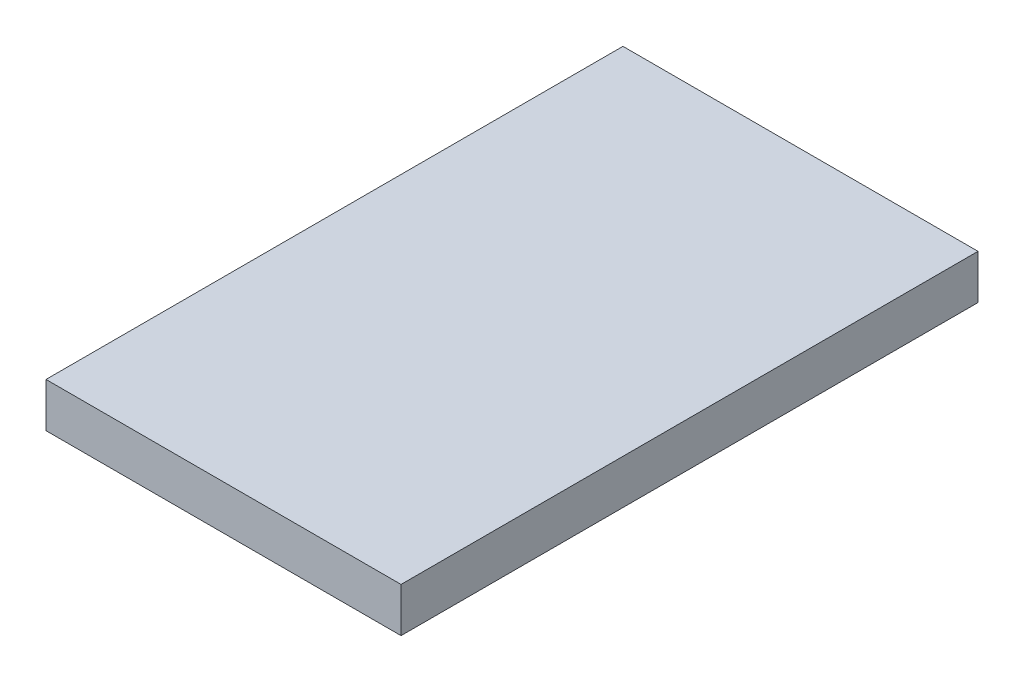
ISO-10303-21;
HEADER;
FILE_DESCRIPTION(('STEP AP214'),'2;1');
FILE_NAME('part.step','',(''),(''),'','','');
FILE_SCHEMA(('AUTOMOTIVE_DESIGN { 1 0 10303 214 1 1 1 1 }'));
ENDSEC;
DATA;
#1=APPLICATION_CONTEXT('core data for automotive mechanical design processes');
#2=APPLICATION_PROTOCOL_DEFINITION('international standard','automotive_design',2000,#1);
#3=PRODUCT_CONTEXT('',#1,'mechanical');
#4=PRODUCT('Part','Part','',(#3));
#5=PRODUCT_RELATED_PRODUCT_CATEGORY('part','',(#4));
#6=PRODUCT_DEFINITION_FORMATION('','',#4);
#7=PRODUCT_DEFINITION_CONTEXT('part definition',#1,'design');
#8=PRODUCT_DEFINITION('design','',#6,#7);
#9=PRODUCT_DEFINITION_SHAPE('','',#8);
#10=(LENGTH_UNIT() NAMED_UNIT(*) SI_UNIT(.MILLI.,.METRE.));
#11=(NAMED_UNIT(*) PLANE_ANGLE_UNIT() SI_UNIT($,.RADIAN.));
#12=(NAMED_UNIT(*) SI_UNIT($,.STERADIAN.) SOLID_ANGLE_UNIT());
#13=UNCERTAINTY_MEASURE_WITH_UNIT(LENGTH_MEASURE(1.E-05),#10,'distance_accuracy_value','');
#14=(GEOMETRIC_REPRESENTATION_CONTEXT(3) GLOBAL_UNCERTAINTY_ASSIGNED_CONTEXT((#13)) GLOBAL_UNIT_ASSIGNED_CONTEXT((#10,
#11,#12)) REPRESENTATION_CONTEXT('',''));
#15=CARTESIAN_POINT('',(0.,0.,0.));
#16=DIRECTION('',(0.,0.,1.));
#17=DIRECTION('',(1.,0.,0.));
#18=AXIS2_PLACEMENT_3D('',#15,#16,#17);
#19=CARTESIAN_POINT('',(0.,0.,0.));
#20=DIRECTION('',(0.,1.,0.));
#21=DIRECTION('',(0.,0.,1.));
#22=AXIS2_PLACEMENT_3D('',#19,#20,#21);
#23=PLANE('',#22);
#24=DIRECTION('',(-1.,0.,0.));
#25=VECTOR('',#24,1.);
#26=CARTESIAN_POINT('',(-4.,0.,6.5));
#27=LINE('',#26,#25);
#28=CARTESIAN_POINT('',(4.,0.,6.5));
#29=VERTEX_POINT('',#28);
#30=CARTESIAN_POINT('',(-4.,0.,6.5));
#31=VERTEX_POINT('',#30);
#32=EDGE_CURVE('E81',#29,#31,#27,.T.);
#33=ORIENTED_EDGE('',*,*,#32,.T.);
#34=DIRECTION('',(0.,0.,-1.));
#35=VECTOR('',#34,1.);
#36=CARTESIAN_POINT('',(-4.,0.,-6.5));
#37=LINE('',#36,#35);
#38=CARTESIAN_POINT('',(-4.,0.,-6.5));
#39=VERTEX_POINT('',#38);
#40=EDGE_CURVE('E68',#31,#39,#37,.T.);
#41=ORIENTED_EDGE('',*,*,#40,.T.);
#42=DIRECTION('',(1.,0.,0.));
#43=VECTOR('',#42,1.);
#44=CARTESIAN_POINT('',(-4.,0.,-6.5));
#45=LINE('',#44,#43);
#46=CARTESIAN_POINT('',(4.,0.,-6.5));
#47=VERTEX_POINT('',#46);
#48=EDGE_CURVE('E55',#39,#47,#45,.T.);
#49=ORIENTED_EDGE('',*,*,#48,.T.);
#50=DIRECTION('',(0.,0.,1.));
#51=VECTOR('',#50,1.);
#52=CARTESIAN_POINT('',(4.,0.,-6.5));
#53=LINE('',#52,#51);
#54=EDGE_CURVE('E20',#47,#29,#53,.T.);
#55=ORIENTED_EDGE('',*,*,#54,.T.);
#56=EDGE_LOOP('',(#33,#41,#49,#55));
#57=FACE_BOUND('',#56,.T.);
#58=ADVANCED_FACE('F17',(#57),#23,.F.);
#59=CARTESIAN_POINT('',(4.,1.,-6.5));
#60=DIRECTION('',(-1.,0.,0.));
#61=DIRECTION('',(0.,0.,1.));
#62=AXIS2_PLACEMENT_3D('',#59,#60,#61);
#63=PLANE('',#62);
#64=DIRECTION('',(0.,1.,0.));
#65=VECTOR('',#64,1.);
#66=CARTESIAN_POINT('',(4.,1.,-6.5));
#67=LINE('',#66,#65);
#68=CARTESIAN_POINT('',(4.,1.,-6.5));
#69=VERTEX_POINT('',#68);
#70=EDGE_CURVE('E61',#47,#69,#67,.T.);
#71=ORIENTED_EDGE('',*,*,#70,.T.);
#72=DIRECTION('',(0.,0.,1.));
#73=VECTOR('',#72,1.);
#74=CARTESIAN_POINT('',(4.,1.,0.));
#75=LINE('',#74,#73);
#76=CARTESIAN_POINT('',(4.,1.,6.5));
#77=VERTEX_POINT('',#76);
#78=EDGE_CURVE('E83',#77,#69,#75,.F.);
#79=ORIENTED_EDGE('',*,*,#78,.F.);
#80=DIRECTION('',(0.,1.,0.));
#81=VECTOR('',#80,1.);
#82=CARTESIAN_POINT('',(4.,1.,6.5));
#83=LINE('',#82,#81);
#84=EDGE_CURVE('E64',#77,#29,#83,.F.);
#85=ORIENTED_EDGE('',*,*,#84,.T.);
#86=ORIENTED_EDGE('',*,*,#54,.F.);
#87=EDGE_LOOP('',(#71,#79,#85,#86));
#88=FACE_BOUND('',#87,.T.);
#89=ADVANCED_FACE('F60',(#88),#63,.F.);
#90=CARTESIAN_POINT('',(-4.,1.,-6.5));
#91=DIRECTION('',(0.,0.,1.));
#92=DIRECTION('',(1.,0.,0.));
#93=AXIS2_PLACEMENT_3D('',#90,#91,#92);
#94=PLANE('',#93);
#95=DIRECTION('',(0.,1.,0.));
#96=VECTOR('',#95,1.);
#97=CARTESIAN_POINT('',(-4.,1.,-6.5));
#98=LINE('',#97,#96);
#99=CARTESIAN_POINT('',(-4.,1.,-6.5));
#100=VERTEX_POINT('',#99);
#101=EDGE_CURVE('E70',#39,#100,#98,.T.);
#102=ORIENTED_EDGE('',*,*,#101,.T.);
#103=DIRECTION('',(1.,0.,0.));
#104=VECTOR('',#103,1.);
#105=CARTESIAN_POINT('',(0.,1.,-6.5));
#106=LINE('',#105,#104);
#107=EDGE_CURVE('E74',#69,#100,#106,.F.);
#108=ORIENTED_EDGE('',*,*,#107,.F.);
#109=ORIENTED_EDGE('',*,*,#70,.F.);
#110=ORIENTED_EDGE('',*,*,#48,.F.);
#111=EDGE_LOOP('',(#102,#108,#109,#110));
#112=FACE_BOUND('',#111,.T.);
#113=ADVANCED_FACE('F72',(#112),#94,.F.);
#114=CARTESIAN_POINT('',(-4.,1.,-6.5));
#115=DIRECTION('',(1.,0.,0.));
#116=DIRECTION('',(0.,0.,-1.));
#117=AXIS2_PLACEMENT_3D('',#114,#115,#116);
#118=PLANE('',#117);
#119=DIRECTION('',(0.,1.,0.));
#120=VECTOR('',#119,1.);
#121=CARTESIAN_POINT('',(-4.,1.,6.5));
#122=LINE('',#121,#120);
#123=CARTESIAN_POINT('',(-4.,1.,6.5));
#124=VERTEX_POINT('',#123);
#125=EDGE_CURVE('E35',#31,#124,#122,.T.);
#126=ORIENTED_EDGE('',*,*,#125,.T.);
#127=DIRECTION('',(0.,0.,1.));
#128=VECTOR('',#127,1.);
#129=CARTESIAN_POINT('',(-4.,1.,0.));
#130=LINE('',#129,#128);
#131=EDGE_CURVE('E26',#100,#124,#130,.T.);
#132=ORIENTED_EDGE('',*,*,#131,.F.);
#133=ORIENTED_EDGE('',*,*,#101,.F.);
#134=ORIENTED_EDGE('',*,*,#40,.F.);
#135=EDGE_LOOP('',(#126,#132,#133,#134));
#136=FACE_BOUND('',#135,.T.);
#137=ADVANCED_FACE('F89',(#136),#118,.F.);
#138=CARTESIAN_POINT('',(-4.,1.,6.5));
#139=DIRECTION('',(0.,0.,-1.));
#140=DIRECTION('',(-1.,0.,0.));
#141=AXIS2_PLACEMENT_3D('',#138,#139,#140);
#142=PLANE('',#141);
#143=ORIENTED_EDGE('',*,*,#84,.F.);
#144=DIRECTION('',(1.,0.,0.));
#145=VECTOR('',#144,1.);
#146=CARTESIAN_POINT('',(0.,1.,6.5));
#147=LINE('',#146,#145);
#148=EDGE_CURVE('E11',#124,#77,#147,.T.);
#149=ORIENTED_EDGE('',*,*,#148,.F.);
#150=ORIENTED_EDGE('',*,*,#125,.F.);
#151=ORIENTED_EDGE('',*,*,#32,.F.);
#152=EDGE_LOOP('',(#143,#149,#150,#151));
#153=FACE_BOUND('',#152,.T.);
#154=ADVANCED_FACE('F91',(#153),#142,.F.);
#155=CARTESIAN_POINT('',(0.,1.,0.));
#156=DIRECTION('',(0.,1.,0.));
#157=DIRECTION('',(0.,0.,1.));
#158=AXIS2_PLACEMENT_3D('',#155,#156,#157);
#159=PLANE('',#158);
#160=ORIENTED_EDGE('',*,*,#131,.T.);
#161=ORIENTED_EDGE('',*,*,#148,.T.);
#162=ORIENTED_EDGE('',*,*,#78,.T.);
#163=ORIENTED_EDGE('',*,*,#107,.T.);
#164=EDGE_LOOP('',(#160,#161,#162,#163));
#165=FACE_BOUND('',#164,.T.);
#166=ADVANCED_FACE('F88',(#165),#159,.T.);
#167=CLOSED_SHELL('',(#58,#89,#113,#137,#154,#166));
#168=MANIFOLD_SOLID_BREP('B1',#167);
#169=ADVANCED_BREP_SHAPE_REPRESENTATION('',(#18,#168),#14);
#170=SHAPE_DEFINITION_REPRESENTATION(#9,#169);
ENDSEC;
END-ISO-10303-21;
